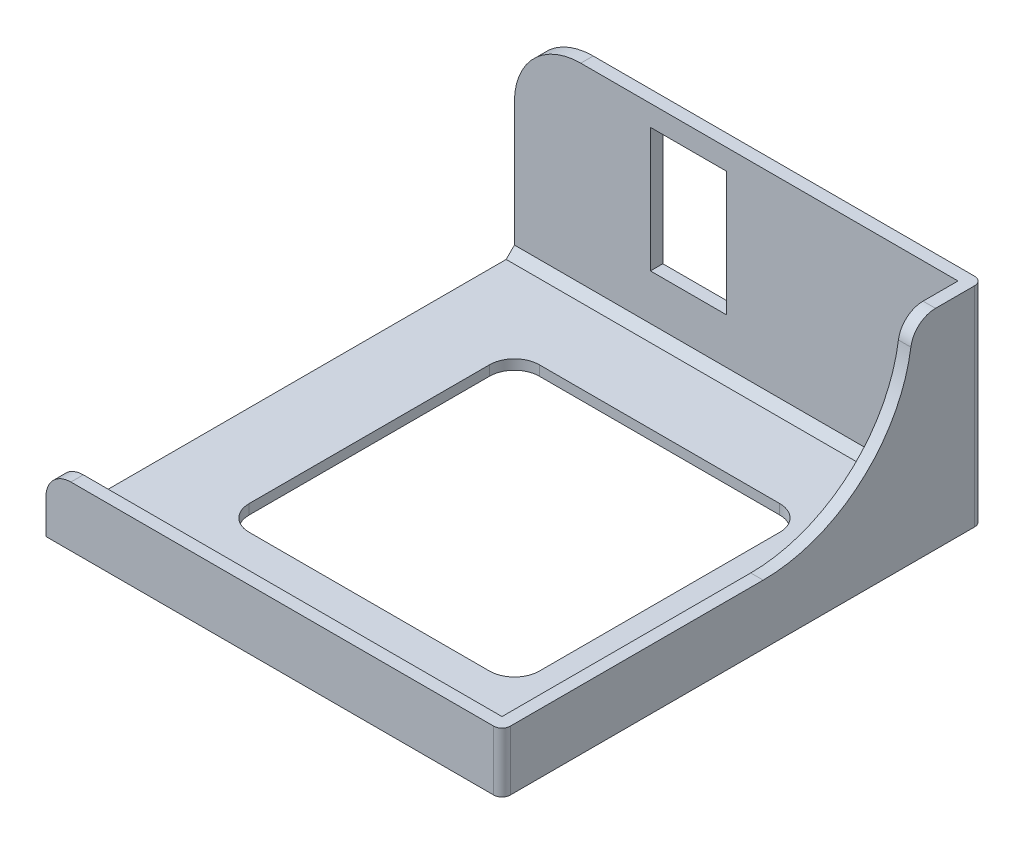
ISO-10303-21;
HEADER;
FILE_DESCRIPTION(('STEP AP214'),'2;1');
FILE_NAME('part.step','',(''),(''),'','','');
FILE_SCHEMA(('AUTOMOTIVE_DESIGN { 1 0 10303 214 1 1 1 1 }'));
ENDSEC;
DATA;
#1=APPLICATION_CONTEXT('core data for automotive mechanical design processes');
#2=APPLICATION_PROTOCOL_DEFINITION('international standard','automotive_design',2000,#1);
#3=PRODUCT_CONTEXT('',#1,'mechanical');
#4=PRODUCT('Part','Part','',(#3));
#5=PRODUCT_RELATED_PRODUCT_CATEGORY('part','',(#4));
#6=PRODUCT_DEFINITION_FORMATION('','',#4);
#7=PRODUCT_DEFINITION_CONTEXT('part definition',#1,'design');
#8=PRODUCT_DEFINITION('design','',#6,#7);
#9=PRODUCT_DEFINITION_SHAPE('','',#8);
#10=(LENGTH_UNIT() NAMED_UNIT(*) SI_UNIT(.MILLI.,.METRE.));
#11=(NAMED_UNIT(*) PLANE_ANGLE_UNIT() SI_UNIT($,.RADIAN.));
#12=(NAMED_UNIT(*) SI_UNIT($,.STERADIAN.) SOLID_ANGLE_UNIT());
#13=UNCERTAINTY_MEASURE_WITH_UNIT(LENGTH_MEASURE(1.E-05),#10,'distance_accuracy_value','');
#14=(GEOMETRIC_REPRESENTATION_CONTEXT(3) GLOBAL_UNCERTAINTY_ASSIGNED_CONTEXT((#13)) GLOBAL_UNIT_ASSIGNED_CONTEXT((#10,
#11,#12)) REPRESENTATION_CONTEXT('',''));
#15=CARTESIAN_POINT('',(0.,0.,0.));
#16=DIRECTION('',(0.,0.,1.));
#17=DIRECTION('',(1.,0.,0.));
#18=AXIS2_PLACEMENT_3D('',#15,#16,#17);
#19=CARTESIAN_POINT('',(26.5,1.2,-28.));
#20=DIRECTION('',(0.,1.,0.));
#21=DIRECTION('',(0.,0.,1.));
#22=AXIS2_PLACEMENT_3D('',#19,#20,#21);
#23=CYLINDRICAL_SURFACE('',#22,1.);
#24=DIRECTION('',(0.,1.,0.));
#25=VECTOR('',#24,1.);
#26=CARTESIAN_POINT('',(27.5,1.2,-28.));
#27=LINE('',#26,#25);
#28=CARTESIAN_POINT('',(27.5,0.,-28.));
#29=VERTEX_POINT('',#28);
#30=CARTESIAN_POINT('',(27.5,25.2,-28.));
#31=VERTEX_POINT('',#30);
#32=EDGE_CURVE('E419',#29,#31,#27,.T.);
#33=ORIENTED_EDGE('',*,*,#32,.F.);
#34=CARTESIAN_POINT('',(26.5,0.,-28.));
#35=DIRECTION('',(0.,-1.,0.));
#36=DIRECTION('',(0.,0.,-1.));
#37=AXIS2_PLACEMENT_3D('',#34,#35,#36);
#38=CIRCLE('',#37,1.);
#39=CARTESIAN_POINT('',(26.5,0.,-29.));
#40=VERTEX_POINT('',#39);
#41=EDGE_CURVE('E425',#40,#29,#38,.T.);
#42=ORIENTED_EDGE('',*,*,#41,.F.);
#43=DIRECTION('',(0.,1.,0.));
#44=VECTOR('',#43,1.);
#45=CARTESIAN_POINT('',(26.5,1.2,-29.));
#46=LINE('',#45,#44);
#47=CARTESIAN_POINT('',(26.5,25.2,-29.));
#48=VERTEX_POINT('',#47);
#49=EDGE_CURVE('E422',#48,#40,#46,.F.);
#50=ORIENTED_EDGE('',*,*,#49,.F.);
#51=CARTESIAN_POINT('',(26.5,25.2,-28.));
#52=DIRECTION('',(0.,1.,0.));
#53=DIRECTION('',(0.,0.,1.));
#54=AXIS2_PLACEMENT_3D('',#51,#52,#53);
#55=CIRCLE('',#54,1.);
#56=EDGE_CURVE('E427',#31,#48,#55,.T.);
#57=ORIENTED_EDGE('',*,*,#56,.F.);
#58=EDGE_LOOP('',(#33,#42,#50,#57));
#59=FACE_BOUND('',#58,.T.);
#60=ADVANCED_FACE('F33',(#59),#23,.T.);
#61=CARTESIAN_POINT('',(26.5,1.2,28.));
#62=DIRECTION('',(0.,1.,0.));
#63=DIRECTION('',(0.,0.,1.));
#64=AXIS2_PLACEMENT_3D('',#61,#62,#63);
#65=CYLINDRICAL_SURFACE('',#64,1.);
#66=DIRECTION('',(0.,1.,0.));
#67=VECTOR('',#66,1.);
#68=CARTESIAN_POINT('',(26.5,1.2,29.));
#69=LINE('',#68,#67);
#70=CARTESIAN_POINT('',(26.5,0.,29.));
#71=VERTEX_POINT('',#70);
#72=CARTESIAN_POINT('',(26.5,7.2,29.));
#73=VERTEX_POINT('',#72);
#74=EDGE_CURVE('E409',#71,#73,#69,.T.);
#75=ORIENTED_EDGE('',*,*,#74,.F.);
#76=CARTESIAN_POINT('',(26.5,0.,28.));
#77=DIRECTION('',(0.,-1.,0.));
#78=DIRECTION('',(0.,0.,-1.));
#79=AXIS2_PLACEMENT_3D('',#76,#77,#78);
#80=CIRCLE('',#79,1.);
#81=CARTESIAN_POINT('',(27.5,0.,28.));
#82=VERTEX_POINT('',#81);
#83=EDGE_CURVE('E415',#82,#71,#80,.T.);
#84=ORIENTED_EDGE('',*,*,#83,.F.);
#85=DIRECTION('',(0.,1.,0.));
#86=VECTOR('',#85,1.);
#87=CARTESIAN_POINT('',(27.5,1.2,28.));
#88=LINE('',#87,#86);
#89=CARTESIAN_POINT('',(27.5,7.2,28.));
#90=VERTEX_POINT('',#89);
#91=EDGE_CURVE('E412',#90,#82,#88,.F.);
#92=ORIENTED_EDGE('',*,*,#91,.F.);
#93=CARTESIAN_POINT('',(26.5,7.2,28.));
#94=DIRECTION('',(0.,-1.,0.));
#95=DIRECTION('',(0.,0.,-1.));
#96=AXIS2_PLACEMENT_3D('',#93,#94,#95);
#97=CIRCLE('',#96,1.);
#98=EDGE_CURVE('E417',#73,#90,#97,.F.);
#99=ORIENTED_EDGE('',*,*,#98,.F.);
#100=EDGE_LOOP('',(#75,#84,#92,#99));
#101=FACE_BOUND('',#100,.T.);
#102=ADVANCED_FACE('F520',(#101),#65,.T.);
#103=CARTESIAN_POINT('',(10.5,22.2,-23.2846096908265));
#104=DIRECTION('',(1.,0.,0.));
#105=DIRECTION('',(0.,0.,-1.));
#106=AXIS2_PLACEMENT_3D('',#103,#104,#105);
#107=CYLINDRICAL_SURFACE('',#106,3.);
#108=DIRECTION('',(-1.,0.,0.));
#109=VECTOR('',#108,1.);
#110=CARTESIAN_POINT('',(10.5,25.2,-23.2846096908265));
#111=LINE('',#110,#109);
#112=CARTESIAN_POINT('',(26.,25.2,-23.2846096908265));
#113=VERTEX_POINT('',#112);
#114=CARTESIAN_POINT('',(27.5,25.2,-23.2846096908265));
#115=VERTEX_POINT('',#114);
#116=EDGE_CURVE('E399',#113,#115,#111,.F.);
#117=ORIENTED_EDGE('',*,*,#116,.F.);
#118=CARTESIAN_POINT('',(26.,22.2,-23.2846096908265));
#119=DIRECTION('',(-1.,0.,0.));
#120=DIRECTION('',(0.,0.,1.));
#121=AXIS2_PLACEMENT_3D('',#118,#119,#120);
#122=CIRCLE('',#121,3.);
#123=CARTESIAN_POINT('',(26.,22.6285714285714,-20.3153797349942));
#124=VERTEX_POINT('',#123);
#125=EDGE_CURVE('E405',#124,#113,#122,.T.);
#126=ORIENTED_EDGE('',*,*,#125,.F.);
#127=DIRECTION('',(1.,0.,0.));
#128=VECTOR('',#127,1.);
#129=CARTESIAN_POINT('',(10.5,22.6285714285714,-20.3153797349942));
#130=LINE('',#129,#128);
#131=CARTESIAN_POINT('',(27.5,22.6285714285714,-20.3153797349942));
#132=VERTEX_POINT('',#131);
#133=EDGE_CURVE('E402',#132,#124,#130,.F.);
#134=ORIENTED_EDGE('',*,*,#133,.F.);
#135=CARTESIAN_POINT('',(27.5,22.2,-23.2846096908265));
#136=DIRECTION('',(-1.,0.,0.));
#137=DIRECTION('',(0.,0.,1.));
#138=AXIS2_PLACEMENT_3D('',#135,#136,#137);
#139=CIRCLE('',#138,3.);
#140=EDGE_CURVE('E407',#115,#132,#139,.F.);
#141=ORIENTED_EDGE('',*,*,#140,.F.);
#142=EDGE_LOOP('',(#117,#126,#134,#141));
#143=FACE_BOUND('',#142,.T.);
#144=ADVANCED_FACE('F515',(#143),#107,.T.);
#145=CARTESIAN_POINT('',(-24.5,4.2,27.5));
#146=DIRECTION('',(0.,0.,1.));
#147=DIRECTION('',(1.,0.,0.));
#148=AXIS2_PLACEMENT_3D('',#145,#146,#147);
#149=CYLINDRICAL_SURFACE('',#148,3.);
#150=CARTESIAN_POINT('',(-24.5,4.2,27.5));
#151=DIRECTION('',(0.,0.,-1.));
#152=DIRECTION('',(-1.,0.,0.));
#153=AXIS2_PLACEMENT_3D('',#150,#151,#152);
#154=CIRCLE('',#153,3.);
#155=CARTESIAN_POINT('',(-27.5,4.2,27.5));
#156=VERTEX_POINT('',#155);
#157=CARTESIAN_POINT('',(-24.5,7.2,27.5));
#158=VERTEX_POINT('',#157);
#159=EDGE_CURVE('E389',#156,#158,#154,.T.);
#160=ORIENTED_EDGE('',*,*,#159,.F.);
#161=DIRECTION('',(0.,0.,1.));
#162=VECTOR('',#161,1.);
#163=CARTESIAN_POINT('',(-27.5,4.2,29.));
#164=LINE('',#163,#162);
#165=CARTESIAN_POINT('',(-27.5,4.2,29.));
#166=VERTEX_POINT('',#165);
#167=EDGE_CURVE('E395',#166,#156,#164,.F.);
#168=ORIENTED_EDGE('',*,*,#167,.F.);
#169=CARTESIAN_POINT('',(-24.5,4.2,29.));
#170=DIRECTION('',(0.,0.,-1.));
#171=DIRECTION('',(-1.,0.,0.));
#172=AXIS2_PLACEMENT_3D('',#169,#170,#171);
#173=CIRCLE('',#172,3.);
#174=CARTESIAN_POINT('',(-24.5,7.2,29.));
#175=VERTEX_POINT('',#174);
#176=EDGE_CURVE('E397',#175,#166,#173,.F.);
#177=ORIENTED_EDGE('',*,*,#176,.F.);
#178=DIRECTION('',(0.,0.,1.));
#179=VECTOR('',#178,1.);
#180=CARTESIAN_POINT('',(-24.5,7.2,27.5));
#181=LINE('',#180,#179);
#182=EDGE_CURVE('E392',#158,#175,#181,.T.);
#183=ORIENTED_EDGE('',*,*,#182,.F.);
#184=EDGE_LOOP('',(#160,#168,#177,#183));
#185=FACE_BOUND('',#184,.T.);
#186=ADVANCED_FACE('F502',(#185),#149,.T.);
#187=CARTESIAN_POINT('',(-19.5,17.2,0.));
#188=DIRECTION('',(0.,0.,-1.));
#189=DIRECTION('',(-1.,0.,0.));
#190=AXIS2_PLACEMENT_3D('',#187,#188,#189);
#191=CYLINDRICAL_SURFACE('',#190,8.);
#192=DIRECTION('',(0.,0.,1.));
#193=VECTOR('',#192,1.);
#194=CARTESIAN_POINT('',(-19.5,25.2,0.));
#195=LINE('',#194,#193);
#196=CARTESIAN_POINT('',(-19.5,25.2,-29.));
#197=VERTEX_POINT('',#196);
#198=CARTESIAN_POINT('',(-19.5,25.2,-27.5));
#199=VERTEX_POINT('',#198);
#200=EDGE_CURVE('E377',#197,#199,#195,.T.);
#201=ORIENTED_EDGE('',*,*,#200,.F.);
#202=CARTESIAN_POINT('',(-19.5,17.2,-29.));
#203=DIRECTION('',(0.,0.,1.));
#204=DIRECTION('',(1.,0.,0.));
#205=AXIS2_PLACEMENT_3D('',#202,#203,#204);
#206=CIRCLE('',#205,8.);
#207=CARTESIAN_POINT('',(-27.5,17.2,-29.));
#208=VERTEX_POINT('',#207);
#209=EDGE_CURVE('E383',#208,#197,#206,.F.);
#210=ORIENTED_EDGE('',*,*,#209,.F.);
#211=DIRECTION('',(0.,0.,1.));
#212=VECTOR('',#211,1.);
#213=CARTESIAN_POINT('',(-27.5,17.2,0.));
#214=LINE('',#213,#212);
#215=CARTESIAN_POINT('',(-27.5,17.2,-27.5));
#216=VERTEX_POINT('',#215);
#217=EDGE_CURVE('E380',#216,#208,#214,.F.);
#218=ORIENTED_EDGE('',*,*,#217,.F.);
#219=CARTESIAN_POINT('',(-19.5,17.2,-27.5));
#220=DIRECTION('',(0.,0.,1.));
#221=DIRECTION('',(1.,0.,0.));
#222=AXIS2_PLACEMENT_3D('',#219,#220,#221);
#223=CIRCLE('',#222,8.);
#224=EDGE_CURVE('E386',#199,#216,#223,.T.);
#225=ORIENTED_EDGE('',*,*,#224,.F.);
#226=EDGE_LOOP('',(#201,#210,#218,#225));
#227=FACE_BOUND('',#226,.T.);
#228=ADVANCED_FACE('F482',(#227),#191,.T.);
#229=CARTESIAN_POINT('',(27.5,1.2,29.));
#230=DIRECTION('',(-1.,0.,0.));
#231=DIRECTION('',(0.,0.,1.));
#232=AXIS2_PLACEMENT_3D('',#229,#230,#231);
#233=PLANE('',#232);
#234=DIRECTION('',(0.,0.,-1.));
#235=VECTOR('',#234,1.);
#236=CARTESIAN_POINT('',(27.5,0.,29.));
#237=LINE('',#236,#235);
#238=EDGE_CURVE('E347',#82,#29,#237,.T.);
#239=ORIENTED_EDGE('',*,*,#238,.T.);
#240=ORIENTED_EDGE('',*,*,#32,.T.);
#241=DIRECTION('',(0.,0.,-1.));
#242=VECTOR('',#241,1.);
#243=CARTESIAN_POINT('',(27.5,25.2,29.));
#244=LINE('',#243,#242);
#245=EDGE_CURVE('E344',#115,#31,#244,.T.);
#246=ORIENTED_EDGE('',*,*,#245,.F.);
#247=ORIENTED_EDGE('',*,*,#140,.T.);
#248=CARTESIAN_POINT('',(27.5,25.2,-2.50000000000001));
#249=DIRECTION('',(1.,0.,0.));
#250=DIRECTION('',(0.,0.,-1.));
#251=AXIS2_PLACEMENT_3D('',#248,#249,#250);
#252=CIRCLE('',#251,18.);
#253=CARTESIAN_POINT('',(27.5,7.2,-2.50000000000002));
#254=VERTEX_POINT('',#253);
#255=EDGE_CURVE('E290',#254,#132,#252,.T.);
#256=ORIENTED_EDGE('',*,*,#255,.F.);
#257=DIRECTION('',(0.,0.,1.));
#258=VECTOR('',#257,1.);
#259=CARTESIAN_POINT('',(27.5,7.2,27.5));
#260=LINE('',#259,#258);
#261=EDGE_CURVE('E298',#254,#90,#260,.T.);
#262=ORIENTED_EDGE('',*,*,#261,.T.);
#263=ORIENTED_EDGE('',*,*,#91,.T.);
#264=EDGE_LOOP('',(#239,#240,#246,#247,#256,#262,#263));
#265=FACE_BOUND('',#264,.T.);
#266=ADVANCED_FACE('F510',(#265),#233,.F.);
#267=CARTESIAN_POINT('',(-27.5,1.2,-29.));
#268=DIRECTION('',(0.,0.,1.));
#269=DIRECTION('',(1.,0.,0.));
#270=AXIS2_PLACEMENT_3D('',#267,#268,#269);
#271=PLANE('',#270);
#272=DIRECTION('',(1.,0.,0.));
#273=VECTOR('',#272,1.);
#274=CARTESIAN_POINT('',(-1.9,22.7,-29.));
#275=LINE('',#274,#273);
#276=CARTESIAN_POINT('',(-11.1,22.7,-29.));
#277=VERTEX_POINT('',#276);
#278=CARTESIAN_POINT('',(-1.9,22.7,-29.));
#279=VERTEX_POINT('',#278);
#280=EDGE_CURVE('E305',#277,#279,#275,.T.);
#281=ORIENTED_EDGE('',*,*,#280,.F.);
#282=DIRECTION('',(0.,1.,0.));
#283=VECTOR('',#282,1.);
#284=CARTESIAN_POINT('',(-11.1,7.7,-29.));
#285=LINE('',#284,#283);
#286=CARTESIAN_POINT('',(-11.1,7.7,-29.));
#287=VERTEX_POINT('',#286);
#288=EDGE_CURVE('E303',#287,#277,#285,.T.);
#289=ORIENTED_EDGE('',*,*,#288,.F.);
#290=DIRECTION('',(-1.,0.,0.));
#291=VECTOR('',#290,1.);
#292=CARTESIAN_POINT('',(-1.9,7.7,-29.));
#293=LINE('',#292,#291);
#294=CARTESIAN_POINT('',(-1.9,7.7,-29.));
#295=VERTEX_POINT('',#294);
#296=EDGE_CURVE('E311',#295,#287,#293,.T.);
#297=ORIENTED_EDGE('',*,*,#296,.F.);
#298=DIRECTION('',(0.,-1.,0.));
#299=VECTOR('',#298,1.);
#300=CARTESIAN_POINT('',(-1.9,7.7,-29.));
#301=LINE('',#300,#299);
#302=EDGE_CURVE('E308',#279,#295,#301,.T.);
#303=ORIENTED_EDGE('',*,*,#302,.F.);
#304=EDGE_LOOP('',(#281,#289,#297,#303));
#305=FACE_BOUND('',#304,.T.);
#306=DIRECTION('',(-1.,0.,0.));
#307=VECTOR('',#306,1.);
#308=CARTESIAN_POINT('',(27.5,25.2,-29.));
#309=LINE('',#308,#307);
#310=EDGE_CURVE('E342',#48,#197,#309,.T.);
#311=ORIENTED_EDGE('',*,*,#310,.F.);
#312=ORIENTED_EDGE('',*,*,#49,.T.);
#313=DIRECTION('',(-1.,0.,0.));
#314=VECTOR('',#313,1.);
#315=CARTESIAN_POINT('',(-27.5,0.,-29.));
#316=LINE('',#315,#314);
#317=CARTESIAN_POINT('',(-27.5,0.,-29.));
#318=VERTEX_POINT('',#317);
#319=EDGE_CURVE('E350',#40,#318,#316,.T.);
#320=ORIENTED_EDGE('',*,*,#319,.T.);
#321=DIRECTION('',(0.,-1.,0.));
#322=VECTOR('',#321,1.);
#323=CARTESIAN_POINT('',(-27.5,1.2,-29.));
#324=LINE('',#323,#322);
#325=EDGE_CURVE('E360',#208,#318,#324,.T.);
#326=ORIENTED_EDGE('',*,*,#325,.F.);
#327=ORIENTED_EDGE('',*,*,#209,.T.);
#328=EDGE_LOOP('',(#311,#312,#320,#326,#327));
#329=FACE_BOUND('',#328,.T.);
#330=ADVANCED_FACE('F487',(#305,#329),#271,.F.);
#331=CARTESIAN_POINT('',(-27.5,1.2,29.));
#332=DIRECTION('',(1.,0.,0.));
#333=DIRECTION('',(0.,0.,-1.));
#334=AXIS2_PLACEMENT_3D('',#331,#332,#333);
#335=PLANE('',#334);
#336=DIRECTION('',(0.,-1.,0.));
#337=VECTOR('',#336,1.);
#338=CARTESIAN_POINT('',(-27.5,1.2,29.));
#339=LINE('',#338,#337);
#340=CARTESIAN_POINT('',(-27.5,0.,29.));
#341=VERTEX_POINT('',#340);
#342=EDGE_CURVE('E358',#166,#341,#339,.T.);
#343=ORIENTED_EDGE('',*,*,#342,.F.);
#344=ORIENTED_EDGE('',*,*,#167,.T.);
#345=DIRECTION('',(0.,-1.,0.));
#346=VECTOR('',#345,1.);
#347=CARTESIAN_POINT('',(-27.5,1.2,27.5));
#348=LINE('',#347,#346);
#349=CARTESIAN_POINT('',(-27.5,2.2,27.5));
#350=VERTEX_POINT('',#349);
#351=EDGE_CURVE('E317',#156,#350,#348,.T.);
#352=ORIENTED_EDGE('',*,*,#351,.T.);
#353=DIRECTION('',(0.,-0.707106781186543,-0.707106781186552));
#354=VECTOR('',#353,1.);
#355=CARTESIAN_POINT('',(-27.5,2.45000000000001,27.75));
#356=LINE('',#355,#354);
#357=CARTESIAN_POINT('',(-27.5,1.2,26.5));
#358=VERTEX_POINT('',#357);
#359=EDGE_CURVE('E42',#350,#358,#356,.T.);
#360=ORIENTED_EDGE('',*,*,#359,.T.);
#361=DIRECTION('',(0.,0.,-1.));
#362=VECTOR('',#361,1.);
#363=CARTESIAN_POINT('',(-27.5,1.2,29.));
#364=LINE('',#363,#362);
#365=CARTESIAN_POINT('',(-27.5,1.2,-26.5));
#366=VERTEX_POINT('',#365);
#367=EDGE_CURVE('E328',#358,#366,#364,.T.);
#368=ORIENTED_EDGE('',*,*,#367,.T.);
#369=DIRECTION('',(0.,0.707106781186542,-0.707106781186553));
#370=VECTOR('',#369,1.);
#371=CARTESIAN_POINT('',(-27.5,-26.55,1.25000000000046));
#372=LINE('',#371,#370);
#373=CARTESIAN_POINT('',(-27.5,2.2,-27.5));
#374=VERTEX_POINT('',#373);
#375=EDGE_CURVE('E11',#366,#374,#372,.T.);
#376=ORIENTED_EDGE('',*,*,#375,.T.);
#377=DIRECTION('',(0.,1.,0.));
#378=VECTOR('',#377,1.);
#379=CARTESIAN_POINT('',(-27.5,1.2,-27.5));
#380=LINE('',#379,#378);
#381=EDGE_CURVE('E326',#374,#216,#380,.T.);
#382=ORIENTED_EDGE('',*,*,#381,.T.);
#383=ORIENTED_EDGE('',*,*,#217,.T.);
#384=ORIENTED_EDGE('',*,*,#325,.T.);
#385=DIRECTION('',(0.,0.,1.));
#386=VECTOR('',#385,1.);
#387=CARTESIAN_POINT('',(-27.5,0.,29.));
#388=LINE('',#387,#386);
#389=EDGE_CURVE('E352',#318,#341,#388,.T.);
#390=ORIENTED_EDGE('',*,*,#389,.T.);
#391=EDGE_LOOP('',(#343,#344,#352,#360,#368,#376,#382,#383,#384,#390));
#392=FACE_BOUND('',#391,.T.);
#393=ADVANCED_FACE('F459',(#392),#335,.F.);
#394=CARTESIAN_POINT('',(-27.5,1.2,29.));
#395=DIRECTION('',(0.,0.,-1.));
#396=DIRECTION('',(-1.,0.,0.));
#397=AXIS2_PLACEMENT_3D('',#394,#395,#396);
#398=PLANE('',#397);
#399=DIRECTION('',(1.,0.,0.));
#400=VECTOR('',#399,1.);
#401=CARTESIAN_POINT('',(-27.5,0.,29.));
#402=LINE('',#401,#400);
#403=EDGE_CURVE('E355',#341,#71,#402,.T.);
#404=ORIENTED_EDGE('',*,*,#403,.T.);
#405=ORIENTED_EDGE('',*,*,#74,.T.);
#406=DIRECTION('',(-1.,0.,0.));
#407=VECTOR('',#406,1.);
#408=CARTESIAN_POINT('',(27.5,7.2,29.));
#409=LINE('',#408,#407);
#410=EDGE_CURVE('E301',#73,#175,#409,.T.);
#411=ORIENTED_EDGE('',*,*,#410,.T.);
#412=ORIENTED_EDGE('',*,*,#176,.T.);
#413=ORIENTED_EDGE('',*,*,#342,.T.);
#414=EDGE_LOOP('',(#404,#405,#411,#412,#413));
#415=FACE_BOUND('',#414,.T.);
#416=ADVANCED_FACE('F498',(#415),#398,.F.);
#417=CARTESIAN_POINT('',(0.,0.,0.));
#418=DIRECTION('',(0.,-1.,0.));
#419=DIRECTION('',(0.,0.,-1.));
#420=AXIS2_PLACEMENT_3D('',#417,#418,#419);
#421=PLANE('',#420);
#422=CARTESIAN_POINT('',(14.5,0.,-14.5));
#423=DIRECTION('',(0.,-1.,0.));
#424=DIRECTION('',(0.,0.,-1.));
#425=AXIS2_PLACEMENT_3D('',#422,#423,#424);
#426=CIRCLE('',#425,3.);
#427=CARTESIAN_POINT('',(14.5,0.,-17.5));
#428=VERTEX_POINT('',#427);
#429=CARTESIAN_POINT('',(17.5,0.,-14.5));
#430=VERTEX_POINT('',#429);
#431=EDGE_CURVE('E287',#428,#430,#426,.T.);
#432=ORIENTED_EDGE('',*,*,#431,.F.);
#433=DIRECTION('',(1.,0.,0.));
#434=VECTOR('',#433,1.);
#435=CARTESIAN_POINT('',(0.,0.,-17.5));
#436=LINE('',#435,#434);
#437=CARTESIAN_POINT('',(-14.5,0.,-17.5));
#438=VERTEX_POINT('',#437);
#439=EDGE_CURVE('E264',#438,#428,#436,.T.);
#440=ORIENTED_EDGE('',*,*,#439,.F.);
#441=CARTESIAN_POINT('',(-14.5,0.,-14.5));
#442=DIRECTION('',(0.,-1.,0.));
#443=DIRECTION('',(0.,0.,-1.));
#444=AXIS2_PLACEMENT_3D('',#441,#442,#443);
#445=CIRCLE('',#444,3.);
#446=CARTESIAN_POINT('',(-17.5,0.,-14.5));
#447=VERTEX_POINT('',#446);
#448=EDGE_CURVE('E231',#447,#438,#445,.T.);
#449=ORIENTED_EDGE('',*,*,#448,.F.);
#450=DIRECTION('',(0.,0.,-1.));
#451=VECTOR('',#450,1.);
#452=CARTESIAN_POINT('',(-17.5,0.,0.));
#453=LINE('',#452,#451);
#454=CARTESIAN_POINT('',(-17.5,0.,14.5));
#455=VERTEX_POINT('',#454);
#456=EDGE_CURVE('E277',#455,#447,#453,.T.);
#457=ORIENTED_EDGE('',*,*,#456,.F.);
#458=CARTESIAN_POINT('',(-14.5,0.,14.5));
#459=DIRECTION('',(0.,-1.,0.));
#460=DIRECTION('',(0.,0.,-1.));
#461=AXIS2_PLACEMENT_3D('',#458,#459,#460);
#462=CIRCLE('',#461,3.);
#463=CARTESIAN_POINT('',(-14.5,0.,17.5));
#464=VERTEX_POINT('',#463);
#465=EDGE_CURVE('E279',#464,#455,#462,.T.);
#466=ORIENTED_EDGE('',*,*,#465,.F.);
#467=DIRECTION('',(-1.,0.,0.));
#468=VECTOR('',#467,1.);
#469=CARTESIAN_POINT('',(0.,0.,17.5));
#470=LINE('',#469,#468);
#471=CARTESIAN_POINT('',(14.5,0.,17.5));
#472=VERTEX_POINT('',#471);
#473=EDGE_CURVE('E281',#472,#464,#470,.T.);
#474=ORIENTED_EDGE('',*,*,#473,.F.);
#475=CARTESIAN_POINT('',(14.5,0.,14.5));
#476=DIRECTION('',(0.,-1.,0.));
#477=DIRECTION('',(0.,0.,-1.));
#478=AXIS2_PLACEMENT_3D('',#475,#476,#477);
#479=CIRCLE('',#478,3.);
#480=CARTESIAN_POINT('',(17.5,0.,14.5));
#481=VERTEX_POINT('',#480);
#482=EDGE_CURVE('E283',#481,#472,#479,.T.);
#483=ORIENTED_EDGE('',*,*,#482,.F.);
#484=DIRECTION('',(0.,0.,1.));
#485=VECTOR('',#484,1.);
#486=CARTESIAN_POINT('',(17.5,0.,0.));
#487=LINE('',#486,#485);
#488=EDGE_CURVE('E285',#430,#481,#487,.T.);
#489=ORIENTED_EDGE('',*,*,#488,.F.);
#490=EDGE_LOOP('',(#432,#440,#449,#457,#466,#474,#483,#489));
#491=FACE_BOUND('',#490,.T.);
#492=ORIENTED_EDGE('',*,*,#319,.F.);
#493=ORIENTED_EDGE('',*,*,#41,.T.);
#494=ORIENTED_EDGE('',*,*,#238,.F.);
#495=ORIENTED_EDGE('',*,*,#83,.T.);
#496=ORIENTED_EDGE('',*,*,#403,.F.);
#497=ORIENTED_EDGE('',*,*,#389,.F.);
#498=EDGE_LOOP('',(#492,#493,#494,#495,#496,#497));
#499=FACE_BOUND('',#498,.T.);
#500=ADVANCED_FACE('F491',(#491,#499),#421,.T.);
#501=CARTESIAN_POINT('',(0.,25.2,0.));
#502=DIRECTION('',(0.,1.,0.));
#503=DIRECTION('',(0.,0.,1.));
#504=AXIS2_PLACEMENT_3D('',#501,#502,#503);
#505=PLANE('',#504);
#506=ORIENTED_EDGE('',*,*,#245,.T.);
#507=ORIENTED_EDGE('',*,*,#56,.T.);
#508=ORIENTED_EDGE('',*,*,#310,.T.);
#509=ORIENTED_EDGE('',*,*,#200,.T.);
#510=DIRECTION('',(-1.,0.,0.));
#511=VECTOR('',#510,1.);
#512=CARTESIAN_POINT('',(26.,25.2,-27.5));
#513=LINE('',#512,#511);
#514=CARTESIAN_POINT('',(26.,25.2,-27.5));
#515=VERTEX_POINT('',#514);
#516=EDGE_CURVE('E333',#515,#199,#513,.T.);
#517=ORIENTED_EDGE('',*,*,#516,.F.);
#518=DIRECTION('',(0.,0.,-1.));
#519=VECTOR('',#518,1.);
#520=CARTESIAN_POINT('',(26.,25.2,27.5));
#521=LINE('',#520,#519);
#522=EDGE_CURVE('E331',#113,#515,#521,.T.);
#523=ORIENTED_EDGE('',*,*,#522,.F.);
#524=ORIENTED_EDGE('',*,*,#116,.T.);
#525=EDGE_LOOP('',(#506,#507,#508,#509,#517,#523,#524));
#526=FACE_BOUND('',#525,.T.);
#527=ADVANCED_FACE('F478',(#526),#505,.T.);
#528=CARTESIAN_POINT('',(26.,25.2,27.5));
#529=DIRECTION('',(-1.,0.,0.));
#530=DIRECTION('',(0.,0.,1.));
#531=AXIS2_PLACEMENT_3D('',#528,#529,#530);
#532=PLANE('',#531);
#533=DIRECTION('',(0.,-1.,0.));
#534=VECTOR('',#533,1.);
#535=CARTESIAN_POINT('',(26.,25.2,-27.5));
#536=LINE('',#535,#534);
#537=CARTESIAN_POINT('',(26.,2.2,-27.5));
#538=VERTEX_POINT('',#537);
#539=EDGE_CURVE('E339',#515,#538,#536,.T.);
#540=ORIENTED_EDGE('',*,*,#539,.T.);
#541=DIRECTION('',(0.,0.,1.));
#542=VECTOR('',#541,1.);
#543=CARTESIAN_POINT('',(26.,2.2,27.5));
#544=LINE('',#543,#542);
#545=CARTESIAN_POINT('',(26.,2.2,27.5));
#546=VERTEX_POINT('',#545);
#547=EDGE_CURVE('E438',#538,#546,#544,.T.);
#548=ORIENTED_EDGE('',*,*,#547,.T.);
#549=DIRECTION('',(0.,-1.,0.));
#550=VECTOR('',#549,1.);
#551=CARTESIAN_POINT('',(26.,25.2,27.5));
#552=LINE('',#551,#550);
#553=CARTESIAN_POINT('',(26.,7.2,27.5));
#554=VERTEX_POINT('',#553);
#555=EDGE_CURVE('E336',#554,#546,#552,.T.);
#556=ORIENTED_EDGE('',*,*,#555,.F.);
#557=DIRECTION('',(0.,0.,1.));
#558=VECTOR('',#557,1.);
#559=CARTESIAN_POINT('',(26.,7.2,27.5));
#560=LINE('',#559,#558);
#561=CARTESIAN_POINT('',(26.,7.2,-2.50000000000002));
#562=VERTEX_POINT('',#561);
#563=EDGE_CURVE('E296',#562,#554,#560,.T.);
#564=ORIENTED_EDGE('',*,*,#563,.F.);
#565=CARTESIAN_POINT('',(26.,25.2,-2.50000000000001));
#566=DIRECTION('',(-1.,0.,0.));
#567=DIRECTION('',(0.,0.,1.));
#568=AXIS2_PLACEMENT_3D('',#565,#566,#567);
#569=CIRCLE('',#568,18.);
#570=EDGE_CURVE('E375',#124,#562,#569,.T.);
#571=ORIENTED_EDGE('',*,*,#570,.F.);
#572=ORIENTED_EDGE('',*,*,#125,.T.);
#573=ORIENTED_EDGE('',*,*,#522,.T.);
#574=EDGE_LOOP('',(#540,#548,#556,#564,#571,#572,#573));
#575=FACE_BOUND('',#574,.T.);
#576=ADVANCED_FACE('F470',(#575),#532,.T.);
#577=CARTESIAN_POINT('',(26.,25.2,-27.5));
#578=DIRECTION('',(0.,0.,1.));
#579=DIRECTION('',(1.,0.,0.));
#580=AXIS2_PLACEMENT_3D('',#577,#578,#579);
#581=PLANE('',#580);
#582=DIRECTION('',(0.,-1.,0.));
#583=VECTOR('',#582,1.);
#584=CARTESIAN_POINT('',(-11.1,25.2,-27.5));
#585=LINE('',#584,#583);
#586=CARTESIAN_POINT('',(-11.1,22.7,-27.5));
#587=VERTEX_POINT('',#586);
#588=CARTESIAN_POINT('',(-11.1,7.7,-27.5));
#589=VERTEX_POINT('',#588);
#590=EDGE_CURVE('E370',#587,#589,#585,.T.);
#591=ORIENTED_EDGE('',*,*,#590,.F.);
#592=DIRECTION('',(-1.,0.,0.));
#593=VECTOR('',#592,1.);
#594=CARTESIAN_POINT('',(26.,22.7,-27.5));
#595=LINE('',#594,#593);
#596=CARTESIAN_POINT('',(-1.9,22.7,-27.5));
#597=VERTEX_POINT('',#596);
#598=EDGE_CURVE('E363',#597,#587,#595,.T.);
#599=ORIENTED_EDGE('',*,*,#598,.F.);
#600=DIRECTION('',(0.,1.,0.));
#601=VECTOR('',#600,1.);
#602=CARTESIAN_POINT('',(-1.9,25.2,-27.5));
#603=LINE('',#602,#601);
#604=CARTESIAN_POINT('',(-1.9,7.7,-27.5));
#605=VERTEX_POINT('',#604);
#606=EDGE_CURVE('E365',#605,#597,#603,.T.);
#607=ORIENTED_EDGE('',*,*,#606,.F.);
#608=DIRECTION('',(1.,0.,0.));
#609=VECTOR('',#608,1.);
#610=CARTESIAN_POINT('',(26.,7.7,-27.5));
#611=LINE('',#610,#609);
#612=EDGE_CURVE('E368',#589,#605,#611,.T.);
#613=ORIENTED_EDGE('',*,*,#612,.F.);
#614=EDGE_LOOP('',(#591,#599,#607,#613));
#615=FACE_BOUND('',#614,.T.);
#616=ORIENTED_EDGE('',*,*,#381,.F.);
#617=DIRECTION('',(1.,0.,0.));
#618=VECTOR('',#617,1.);
#619=CARTESIAN_POINT('',(26.,2.2,-27.5));
#620=LINE('',#619,#618);
#621=EDGE_CURVE('E440',#374,#538,#620,.T.);
#622=ORIENTED_EDGE('',*,*,#621,.T.);
#623=ORIENTED_EDGE('',*,*,#539,.F.);
#624=ORIENTED_EDGE('',*,*,#516,.T.);
#625=ORIENTED_EDGE('',*,*,#224,.T.);
#626=EDGE_LOOP('',(#616,#622,#623,#624,#625));
#627=FACE_BOUND('',#626,.T.);
#628=ADVANCED_FACE('F476',(#615,#627),#581,.T.);
#629=CARTESIAN_POINT('',(-26.,25.2,27.5));
#630=DIRECTION('',(0.,0.,-1.));
#631=DIRECTION('',(-1.,0.,0.));
#632=AXIS2_PLACEMENT_3D('',#629,#630,#631);
#633=PLANE('',#632);
#634=ORIENTED_EDGE('',*,*,#555,.T.);
#635=DIRECTION('',(-1.,0.,0.));
#636=VECTOR('',#635,1.);
#637=CARTESIAN_POINT('',(-26.,2.2,27.5));
#638=LINE('',#637,#636);
#639=EDGE_CURVE('E436',#546,#350,#638,.T.);
#640=ORIENTED_EDGE('',*,*,#639,.T.);
#641=ORIENTED_EDGE('',*,*,#351,.F.);
#642=ORIENTED_EDGE('',*,*,#159,.T.);
#643=DIRECTION('',(-1.,0.,0.));
#644=VECTOR('',#643,1.);
#645=CARTESIAN_POINT('',(-26.,7.2,27.5));
#646=LINE('',#645,#644);
#647=EDGE_CURVE('E372',#554,#158,#646,.T.);
#648=ORIENTED_EDGE('',*,*,#647,.F.);
#649=EDGE_LOOP('',(#634,#640,#641,#642,#648));
#650=FACE_BOUND('',#649,.T.);
#651=ADVANCED_FACE('F465',(#650),#633,.T.);
#652=CARTESIAN_POINT('',(0.,1.2,0.));
#653=DIRECTION('',(0.,-1.,0.));
#654=DIRECTION('',(0.,0.,-1.));
#655=AXIS2_PLACEMENT_3D('',#652,#653,#654);
#656=PLANE('',#655);
#657=DIRECTION('',(-1.,0.,0.));
#658=VECTOR('',#657,1.);
#659=CARTESIAN_POINT('',(-14.5,1.2,-17.5));
#660=LINE('',#659,#658);
#661=CARTESIAN_POINT('',(14.5,1.2,-17.5));
#662=VERTEX_POINT('',#661);
#663=CARTESIAN_POINT('',(-14.5,1.2,-17.5));
#664=VERTEX_POINT('',#663);
#665=EDGE_CURVE('E237',#662,#664,#660,.T.);
#666=ORIENTED_EDGE('',*,*,#665,.F.);
#667=CARTESIAN_POINT('',(14.5,1.2,-14.5));
#668=DIRECTION('',(0.,1.,0.));
#669=DIRECTION('',(0.,0.,-1.));
#670=AXIS2_PLACEMENT_3D('',#667,#668,#669);
#671=CIRCLE('',#670,3.);
#672=CARTESIAN_POINT('',(17.5,1.2,-14.5));
#673=VERTEX_POINT('',#672);
#674=EDGE_CURVE('E58',#673,#662,#671,.T.);
#675=ORIENTED_EDGE('',*,*,#674,.F.);
#676=DIRECTION('',(0.,0.,-1.));
#677=VECTOR('',#676,1.);
#678=CARTESIAN_POINT('',(17.5,1.2,14.5));
#679=LINE('',#678,#677);
#680=CARTESIAN_POINT('',(17.5,1.2,14.5));
#681=VERTEX_POINT('',#680);
#682=EDGE_CURVE('E259',#681,#673,#679,.T.);
#683=ORIENTED_EDGE('',*,*,#682,.F.);
#684=CARTESIAN_POINT('',(14.5,1.2,14.5));
#685=DIRECTION('',(0.,1.,0.));
#686=DIRECTION('',(0.,0.,-1.));
#687=AXIS2_PLACEMENT_3D('',#684,#685,#686);
#688=CIRCLE('',#687,3.);
#689=CARTESIAN_POINT('',(14.5,1.2,17.5));
#690=VERTEX_POINT('',#689);
#691=EDGE_CURVE('E256',#690,#681,#688,.T.);
#692=ORIENTED_EDGE('',*,*,#691,.F.);
#693=DIRECTION('',(1.,0.,0.));
#694=VECTOR('',#693,1.);
#695=CARTESIAN_POINT('',(-14.5,1.2,17.5));
#696=LINE('',#695,#694);
#697=CARTESIAN_POINT('',(-14.5,1.2,17.5));
#698=VERTEX_POINT('',#697);
#699=EDGE_CURVE('E253',#698,#690,#696,.T.);
#700=ORIENTED_EDGE('',*,*,#699,.F.);
#701=CARTESIAN_POINT('',(-14.5,1.2,14.5));
#702=DIRECTION('',(0.,1.,0.));
#703=DIRECTION('',(0.,0.,-1.));
#704=AXIS2_PLACEMENT_3D('',#701,#702,#703);
#705=CIRCLE('',#704,3.);
#706=CARTESIAN_POINT('',(-17.5,1.2,14.5));
#707=VERTEX_POINT('',#706);
#708=EDGE_CURVE('E247',#707,#698,#705,.T.);
#709=ORIENTED_EDGE('',*,*,#708,.F.);
#710=DIRECTION('',(0.,0.,1.));
#711=VECTOR('',#710,1.);
#712=CARTESIAN_POINT('',(-17.5,1.2,14.5));
#713=LINE('',#712,#711);
#714=CARTESIAN_POINT('',(-17.5,1.2,-14.5));
#715=VERTEX_POINT('',#714);
#716=EDGE_CURVE('E245',#715,#707,#713,.T.);
#717=ORIENTED_EDGE('',*,*,#716,.F.);
#718=CARTESIAN_POINT('',(-14.5,1.2,-14.5));
#719=DIRECTION('',(0.,1.,0.));
#720=DIRECTION('',(0.,0.,1.));
#721=AXIS2_PLACEMENT_3D('',#718,#719,#720);
#722=CIRCLE('',#721,3.);
#723=EDGE_CURVE('E228',#664,#715,#722,.T.);
#724=ORIENTED_EDGE('',*,*,#723,.F.);
#725=EDGE_LOOP('',(#666,#675,#683,#692,#700,#709,#717,#724));
#726=FACE_BOUND('',#725,.T.);
#727=ORIENTED_EDGE('',*,*,#367,.F.);
#728=DIRECTION('',(1.,0.,0.));
#729=VECTOR('',#728,1.);
#730=CARTESIAN_POINT('',(0.,1.2,26.5));
#731=LINE('',#730,#729);
#732=CARTESIAN_POINT('',(25.,1.2,26.5));
#733=VERTEX_POINT('',#732);
#734=EDGE_CURVE('E433',#358,#733,#731,.T.);
#735=ORIENTED_EDGE('',*,*,#734,.T.);
#736=DIRECTION('',(0.,0.,-1.));
#737=VECTOR('',#736,1.);
#738=CARTESIAN_POINT('',(25.,1.2,0.));
#739=LINE('',#738,#737);
#740=CARTESIAN_POINT('',(25.,1.2,-26.5));
#741=VERTEX_POINT('',#740);
#742=EDGE_CURVE('E431',#733,#741,#739,.T.);
#743=ORIENTED_EDGE('',*,*,#742,.T.);
#744=DIRECTION('',(-1.,0.,0.));
#745=VECTOR('',#744,1.);
#746=CARTESIAN_POINT('',(0.,1.2,-26.5));
#747=LINE('',#746,#745);
#748=EDGE_CURVE('E429',#741,#366,#747,.T.);
#749=ORIENTED_EDGE('',*,*,#748,.T.);
#750=EDGE_LOOP('',(#727,#735,#743,#749));
#751=FACE_BOUND('',#750,.T.);
#752=ADVANCED_FACE('F241',(#726,#751),#656,.F.);
#753=CARTESIAN_POINT('',(-11.1,7.7,-12.));
#754=DIRECTION('',(-1.,0.,0.));
#755=DIRECTION('',(0.,0.,1.));
#756=AXIS2_PLACEMENT_3D('',#753,#754,#755);
#757=PLANE('',#756);
#758=ORIENTED_EDGE('',*,*,#590,.T.);
#759=DIRECTION('',(0.,0.,-1.));
#760=VECTOR('',#759,1.);
#761=CARTESIAN_POINT('',(-11.1,7.7,-12.));
#762=LINE('',#761,#760);
#763=EDGE_CURVE('E315',#589,#287,#762,.T.);
#764=ORIENTED_EDGE('',*,*,#763,.T.);
#765=ORIENTED_EDGE('',*,*,#288,.T.);
#766=DIRECTION('',(0.,0.,-1.));
#767=VECTOR('',#766,1.);
#768=CARTESIAN_POINT('',(-11.1,22.7,-12.));
#769=LINE('',#768,#767);
#770=EDGE_CURVE('E314',#587,#277,#769,.T.);
#771=ORIENTED_EDGE('',*,*,#770,.F.);
#772=EDGE_LOOP('',(#758,#764,#765,#771));
#773=FACE_BOUND('',#772,.T.);
#774=ADVANCED_FACE('F553',(#773),#757,.F.);
#775=CARTESIAN_POINT('',(-1.9,7.7,-12.));
#776=DIRECTION('',(0.,-1.,0.));
#777=DIRECTION('',(0.,0.,-1.));
#778=AXIS2_PLACEMENT_3D('',#775,#776,#777);
#779=PLANE('',#778);
#780=ORIENTED_EDGE('',*,*,#612,.T.);
#781=DIRECTION('',(0.,0.,-1.));
#782=VECTOR('',#781,1.);
#783=CARTESIAN_POINT('',(-1.9,7.7,-12.));
#784=LINE('',#783,#782);
#785=EDGE_CURVE('E318',#605,#295,#784,.T.);
#786=ORIENTED_EDGE('',*,*,#785,.T.);
#787=ORIENTED_EDGE('',*,*,#296,.T.);
#788=ORIENTED_EDGE('',*,*,#763,.F.);
#789=EDGE_LOOP('',(#780,#786,#787,#788));
#790=FACE_BOUND('',#789,.T.);
#791=ADVANCED_FACE('F549',(#790),#779,.F.);
#792=CARTESIAN_POINT('',(-1.9,7.7,-12.));
#793=DIRECTION('',(1.,0.,0.));
#794=DIRECTION('',(0.,0.,-1.));
#795=AXIS2_PLACEMENT_3D('',#792,#793,#794);
#796=PLANE('',#795);
#797=ORIENTED_EDGE('',*,*,#606,.T.);
#798=DIRECTION('',(0.,0.,-1.));
#799=VECTOR('',#798,1.);
#800=CARTESIAN_POINT('',(-1.9,22.7,-12.));
#801=LINE('',#800,#799);
#802=EDGE_CURVE('E320',#597,#279,#801,.T.);
#803=ORIENTED_EDGE('',*,*,#802,.T.);
#804=ORIENTED_EDGE('',*,*,#302,.T.);
#805=ORIENTED_EDGE('',*,*,#785,.F.);
#806=EDGE_LOOP('',(#797,#803,#804,#805));
#807=FACE_BOUND('',#806,.T.);
#808=ADVANCED_FACE('F552',(#807),#796,.F.);
#809=CARTESIAN_POINT('',(-1.9,22.7,-12.));
#810=DIRECTION('',(0.,1.,0.));
#811=DIRECTION('',(0.,0.,1.));
#812=AXIS2_PLACEMENT_3D('',#809,#810,#811);
#813=PLANE('',#812);
#814=ORIENTED_EDGE('',*,*,#598,.T.);
#815=ORIENTED_EDGE('',*,*,#770,.T.);
#816=ORIENTED_EDGE('',*,*,#280,.T.);
#817=ORIENTED_EDGE('',*,*,#802,.F.);
#818=EDGE_LOOP('',(#814,#815,#816,#817));
#819=FACE_BOUND('',#818,.T.);
#820=ADVANCED_FACE('F544',(#819),#813,.F.);
#821=CARTESIAN_POINT('',(27.5,7.2,27.5));
#822=DIRECTION('',(0.,-1.,0.));
#823=DIRECTION('',(0.,0.,-1.));
#824=AXIS2_PLACEMENT_3D('',#821,#822,#823);
#825=PLANE('',#824);
#826=ORIENTED_EDGE('',*,*,#410,.F.);
#827=ORIENTED_EDGE('',*,*,#98,.T.);
#828=ORIENTED_EDGE('',*,*,#261,.F.);
#829=DIRECTION('',(1.,0.,0.));
#830=VECTOR('',#829,1.);
#831=CARTESIAN_POINT('',(10.5,7.2,-2.50000000000002));
#832=LINE('',#831,#830);
#833=EDGE_CURVE('E293',#562,#254,#832,.T.);
#834=ORIENTED_EDGE('',*,*,#833,.F.);
#835=ORIENTED_EDGE('',*,*,#563,.T.);
#836=ORIENTED_EDGE('',*,*,#647,.T.);
#837=ORIENTED_EDGE('',*,*,#182,.T.);
#838=EDGE_LOOP('',(#826,#827,#828,#834,#835,#836,#837));
#839=FACE_BOUND('',#838,.T.);
#840=ADVANCED_FACE('F504',(#839),#825,.F.);
#841=CARTESIAN_POINT('',(10.5,25.2,-2.50000000000001));
#842=DIRECTION('',(1.,0.,0.));
#843=DIRECTION('',(0.,0.,-1.));
#844=AXIS2_PLACEMENT_3D('',#841,#842,#843);
#845=CYLINDRICAL_SURFACE('',#844,18.);
#846=ORIENTED_EDGE('',*,*,#255,.T.);
#847=ORIENTED_EDGE('',*,*,#133,.T.);
#848=ORIENTED_EDGE('',*,*,#570,.T.);
#849=ORIENTED_EDGE('',*,*,#833,.T.);
#850=EDGE_LOOP('',(#846,#847,#848,#849));
#851=FACE_BOUND('',#850,.T.);
#852=ADVANCED_FACE('F508',(#851),#845,.F.);
#853=CARTESIAN_POINT('',(0.,1.2,-26.5));
#854=DIRECTION('',(0.,-0.707106781186553,-0.707106781186542));
#855=DIRECTION('',(-1.,0.,0.));
#856=AXIS2_PLACEMENT_3D('',#853,#854,#855);
#857=PLANE('',#856);
#858=ORIENTED_EDGE('',*,*,#375,.F.);
#859=ORIENTED_EDGE('',*,*,#748,.F.);
#860=DIRECTION('',(0.577350269189628,0.57735026918962,-0.577350269189629));
#861=VECTOR('',#860,1.);
#862=CARTESIAN_POINT('',(16.1666666666666,-7.63333333333329,-17.6666666666666));
#863=LINE('',#862,#861);
#864=EDGE_CURVE('E37',#538,#741,#863,.F.);
#865=ORIENTED_EDGE('',*,*,#864,.F.);
#866=ORIENTED_EDGE('',*,*,#621,.F.);
#867=EDGE_LOOP('',(#858,#859,#865,#866));
#868=FACE_BOUND('',#867,.T.);
#869=ADVANCED_FACE('F35',(#868),#857,.F.);
#870=CARTESIAN_POINT('',(25.,1.2,0.));
#871=DIRECTION('',(0.707106781186543,-0.707106781186553,0.));
#872=DIRECTION('',(0.,0.,-1.));
#873=AXIS2_PLACEMENT_3D('',#870,#871,#872);
#874=PLANE('',#873);
#875=ORIENTED_EDGE('',*,*,#864,.T.);
#876=ORIENTED_EDGE('',*,*,#742,.F.);
#877=DIRECTION('',(0.577350269189629,0.577350269189621,0.577350269189628));
#878=VECTOR('',#877,1.);
#879=CARTESIAN_POINT('',(16.6666666666666,-7.1333333333333,18.1666666666666));
#880=LINE('',#879,#878);
#881=EDGE_CURVE('E289',#546,#733,#880,.F.);
#882=ORIENTED_EDGE('',*,*,#881,.F.);
#883=ORIENTED_EDGE('',*,*,#547,.F.);
#884=EDGE_LOOP('',(#875,#876,#882,#883));
#885=FACE_BOUND('',#884,.T.);
#886=ADVANCED_FACE('F451',(#885),#874,.F.);
#887=CARTESIAN_POINT('',(0.,1.2,26.5));
#888=DIRECTION('',(0.,-0.707106781186552,0.707106781186543));
#889=DIRECTION('',(1.,0.,0.));
#890=AXIS2_PLACEMENT_3D('',#887,#888,#889);
#891=PLANE('',#890);
#892=ORIENTED_EDGE('',*,*,#359,.F.);
#893=ORIENTED_EDGE('',*,*,#639,.F.);
#894=ORIENTED_EDGE('',*,*,#881,.T.);
#895=ORIENTED_EDGE('',*,*,#734,.F.);
#896=EDGE_LOOP('',(#892,#893,#894,#895));
#897=FACE_BOUND('',#896,.T.);
#898=ADVANCED_FACE('F463',(#897),#891,.F.);
#899=CARTESIAN_POINT('',(14.5,-15.8,-14.5));
#900=DIRECTION('',(0.,1.,0.));
#901=DIRECTION('',(0.,0.,1.));
#902=AXIS2_PLACEMENT_3D('',#899,#900,#901);
#903=CYLINDRICAL_SURFACE('',#902,3.);
#904=ORIENTED_EDGE('',*,*,#431,.T.);
#905=DIRECTION('',(0.,1.,0.));
#906=VECTOR('',#905,1.);
#907=CARTESIAN_POINT('',(17.5,-15.8,-14.5));
#908=LINE('',#907,#906);
#909=EDGE_CURVE('E262',#430,#673,#908,.T.);
#910=ORIENTED_EDGE('',*,*,#909,.T.);
#911=ORIENTED_EDGE('',*,*,#674,.T.);
#912=DIRECTION('',(0.,1.,0.));
#913=VECTOR('',#912,1.);
#914=CARTESIAN_POINT('',(14.5,-15.8,-17.5));
#915=LINE('',#914,#913);
#916=EDGE_CURVE('E234',#428,#662,#915,.T.);
#917=ORIENTED_EDGE('',*,*,#916,.F.);
#918=EDGE_LOOP('',(#904,#910,#911,#917));
#919=FACE_BOUND('',#918,.T.);
#920=ADVANCED_FACE('F532',(#919),#903,.F.);
#921=CARTESIAN_POINT('',(17.5,-15.8,14.5));
#922=DIRECTION('',(1.,0.,0.));
#923=DIRECTION('',(0.,0.,-1.));
#924=AXIS2_PLACEMENT_3D('',#921,#922,#923);
#925=PLANE('',#924);
#926=ORIENTED_EDGE('',*,*,#488,.T.);
#927=DIRECTION('',(0.,1.,0.));
#928=VECTOR('',#927,1.);
#929=CARTESIAN_POINT('',(17.5,-15.8,14.5));
#930=LINE('',#929,#928);
#931=EDGE_CURVE('E265',#481,#681,#930,.T.);
#932=ORIENTED_EDGE('',*,*,#931,.T.);
#933=ORIENTED_EDGE('',*,*,#682,.T.);
#934=ORIENTED_EDGE('',*,*,#909,.F.);
#935=EDGE_LOOP('',(#926,#932,#933,#934));
#936=FACE_BOUND('',#935,.T.);
#937=ADVANCED_FACE('F697',(#936),#925,.F.);
#938=CARTESIAN_POINT('',(14.5,-15.8,14.5));
#939=DIRECTION('',(0.,1.,0.));
#940=DIRECTION('',(0.,0.,1.));
#941=AXIS2_PLACEMENT_3D('',#938,#939,#940);
#942=CYLINDRICAL_SURFACE('',#941,3.);
#943=ORIENTED_EDGE('',*,*,#482,.T.);
#944=DIRECTION('',(0.,1.,0.));
#945=VECTOR('',#944,1.);
#946=CARTESIAN_POINT('',(14.5,-15.8,17.5));
#947=LINE('',#946,#945);
#948=EDGE_CURVE('E267',#472,#690,#947,.T.);
#949=ORIENTED_EDGE('',*,*,#948,.T.);
#950=ORIENTED_EDGE('',*,*,#691,.T.);
#951=ORIENTED_EDGE('',*,*,#931,.F.);
#952=EDGE_LOOP('',(#943,#949,#950,#951));
#953=FACE_BOUND('',#952,.T.);
#954=ADVANCED_FACE('F704',(#953),#942,.F.);
#955=CARTESIAN_POINT('',(-14.5,-15.8,17.5));
#956=DIRECTION('',(0.,0.,1.));
#957=DIRECTION('',(1.,0.,0.));
#958=AXIS2_PLACEMENT_3D('',#955,#956,#957);
#959=PLANE('',#958);
#960=ORIENTED_EDGE('',*,*,#473,.T.);
#961=DIRECTION('',(0.,1.,0.));
#962=VECTOR('',#961,1.);
#963=CARTESIAN_POINT('',(-14.5,-15.8,17.5));
#964=LINE('',#963,#962);
#965=EDGE_CURVE('E269',#464,#698,#964,.T.);
#966=ORIENTED_EDGE('',*,*,#965,.T.);
#967=ORIENTED_EDGE('',*,*,#699,.T.);
#968=ORIENTED_EDGE('',*,*,#948,.F.);
#969=EDGE_LOOP('',(#960,#966,#967,#968));
#970=FACE_BOUND('',#969,.T.);
#971=ADVANCED_FACE('F713',(#970),#959,.F.);
#972=CARTESIAN_POINT('',(-14.5,-15.8,14.5));
#973=DIRECTION('',(0.,1.,0.));
#974=DIRECTION('',(0.,0.,1.));
#975=AXIS2_PLACEMENT_3D('',#972,#973,#974);
#976=CYLINDRICAL_SURFACE('',#975,3.);
#977=ORIENTED_EDGE('',*,*,#465,.T.);
#978=DIRECTION('',(0.,1.,0.));
#979=VECTOR('',#978,1.);
#980=CARTESIAN_POINT('',(-17.5,-15.8,14.5));
#981=LINE('',#980,#979);
#982=EDGE_CURVE('E271',#455,#707,#981,.T.);
#983=ORIENTED_EDGE('',*,*,#982,.T.);
#984=ORIENTED_EDGE('',*,*,#708,.T.);
#985=ORIENTED_EDGE('',*,*,#965,.F.);
#986=EDGE_LOOP('',(#977,#983,#984,#985));
#987=FACE_BOUND('',#986,.T.);
#988=ADVANCED_FACE('F722',(#987),#976,.F.);
#989=CARTESIAN_POINT('',(-17.5,-15.8,14.5));
#990=DIRECTION('',(-1.,0.,0.));
#991=DIRECTION('',(0.,0.,1.));
#992=AXIS2_PLACEMENT_3D('',#989,#990,#991);
#993=PLANE('',#992);
#994=ORIENTED_EDGE('',*,*,#456,.T.);
#995=DIRECTION('',(0.,1.,0.));
#996=VECTOR('',#995,1.);
#997=CARTESIAN_POINT('',(-17.5,-15.8,-14.5));
#998=LINE('',#997,#996);
#999=EDGE_CURVE('E233',#447,#715,#998,.T.);
#1000=ORIENTED_EDGE('',*,*,#999,.T.);
#1001=ORIENTED_EDGE('',*,*,#716,.T.);
#1002=ORIENTED_EDGE('',*,*,#982,.F.);
#1003=EDGE_LOOP('',(#994,#1000,#1001,#1002));
#1004=FACE_BOUND('',#1003,.T.);
#1005=ADVANCED_FACE('F731',(#1004),#993,.F.);
#1006=CARTESIAN_POINT('',(-14.5,-15.8,-14.5));
#1007=DIRECTION('',(0.,1.,0.));
#1008=DIRECTION('',(0.,0.,1.));
#1009=AXIS2_PLACEMENT_3D('',#1006,#1007,#1008);
#1010=CYLINDRICAL_SURFACE('',#1009,3.);
#1011=ORIENTED_EDGE('',*,*,#448,.T.);
#1012=DIRECTION('',(0.,1.,0.));
#1013=VECTOR('',#1012,1.);
#1014=CARTESIAN_POINT('',(-14.5,-15.8,-17.5));
#1015=LINE('',#1014,#1013);
#1016=EDGE_CURVE('E50',#438,#664,#1015,.T.);
#1017=ORIENTED_EDGE('',*,*,#1016,.T.);
#1018=ORIENTED_EDGE('',*,*,#723,.T.);
#1019=ORIENTED_EDGE('',*,*,#999,.F.);
#1020=EDGE_LOOP('',(#1011,#1017,#1018,#1019));
#1021=FACE_BOUND('',#1020,.T.);
#1022=ADVANCED_FACE('F225',(#1021),#1010,.F.);
#1023=CARTESIAN_POINT('',(-14.5,-15.8,-17.5));
#1024=DIRECTION('',(0.,0.,-1.));
#1025=DIRECTION('',(-1.,0.,0.));
#1026=AXIS2_PLACEMENT_3D('',#1023,#1024,#1025);
#1027=PLANE('',#1026);
#1028=ORIENTED_EDGE('',*,*,#439,.T.);
#1029=ORIENTED_EDGE('',*,*,#916,.T.);
#1030=ORIENTED_EDGE('',*,*,#665,.T.);
#1031=ORIENTED_EDGE('',*,*,#1016,.F.);
#1032=EDGE_LOOP('',(#1028,#1029,#1030,#1031));
#1033=FACE_BOUND('',#1032,.T.);
#1034=ADVANCED_FACE('F238',(#1033),#1027,.F.);
#1035=CLOSED_SHELL('',(#60,#102,#144,#186,#228,#266,#330,#393,#416,#500,#527,#576,#628,#651,
#752,#774,#791,#808,#820,#840,#852,#869,#886,#898,#920,#937,#954,#971,#988,#1005,#1022,#1034));
#1036=MANIFOLD_SOLID_BREP('B2',#1035);
#1037=ADVANCED_BREP_SHAPE_REPRESENTATION('',(#18,#1036),#14);
#1038=SHAPE_DEFINITION_REPRESENTATION(#9,#1037);
ENDSEC;
END-ISO-10303-21;
